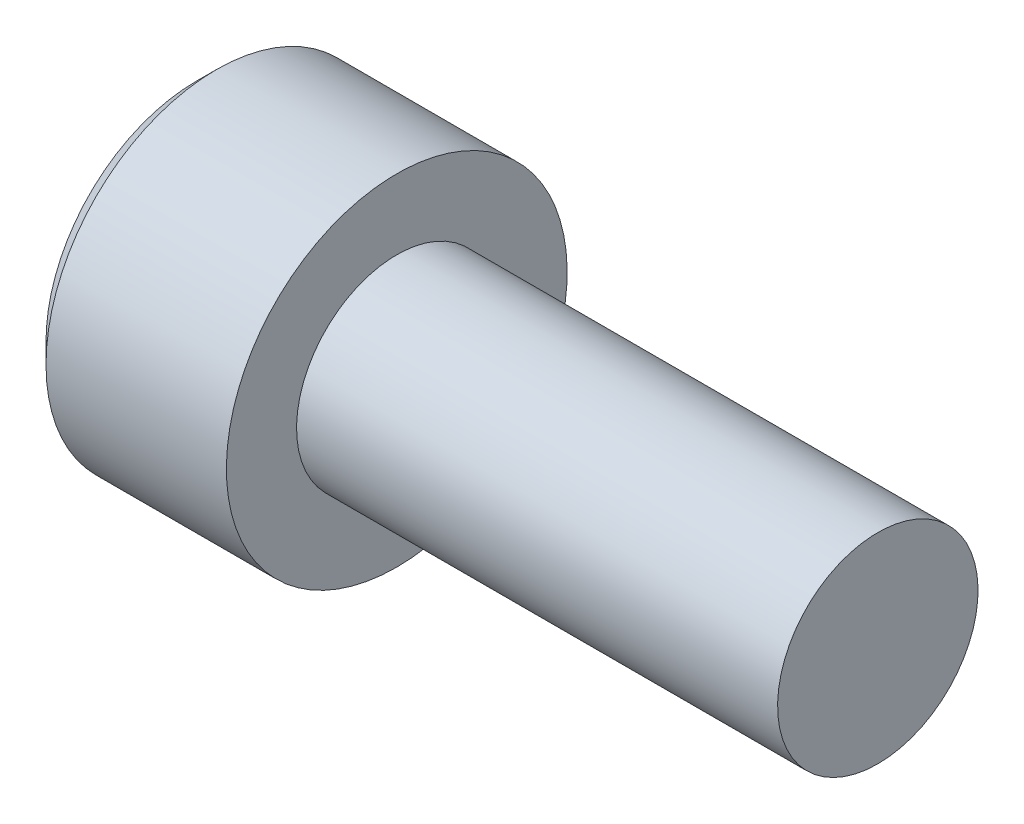
ISO-10303-21;
HEADER;
FILE_DESCRIPTION(('STEP AP214'),'2;1');
FILE_NAME('part.step','',(''),(''),'','','');
FILE_SCHEMA(('AUTOMOTIVE_DESIGN { 1 0 10303 214 1 1 1 1 }'));
ENDSEC;
DATA;
#1=APPLICATION_CONTEXT('core data for automotive mechanical design processes');
#2=APPLICATION_PROTOCOL_DEFINITION('international standard','automotive_design',2000,#1);
#3=PRODUCT_CONTEXT('',#1,'mechanical');
#4=PRODUCT('Part','Part','',(#3));
#5=PRODUCT_RELATED_PRODUCT_CATEGORY('part','',(#4));
#6=PRODUCT_DEFINITION_FORMATION('','',#4);
#7=PRODUCT_DEFINITION_CONTEXT('part definition',#1,'design');
#8=PRODUCT_DEFINITION('design','',#6,#7);
#9=PRODUCT_DEFINITION_SHAPE('','',#8);
#10=(LENGTH_UNIT() NAMED_UNIT(*) SI_UNIT(.MILLI.,.METRE.));
#11=(NAMED_UNIT(*) PLANE_ANGLE_UNIT() SI_UNIT($,.RADIAN.));
#12=(NAMED_UNIT(*) SI_UNIT($,.STERADIAN.) SOLID_ANGLE_UNIT());
#13=UNCERTAINTY_MEASURE_WITH_UNIT(LENGTH_MEASURE(1.E-05),#10,'distance_accuracy_value','');
#14=(GEOMETRIC_REPRESENTATION_CONTEXT(3) GLOBAL_UNCERTAINTY_ASSIGNED_CONTEXT((#13)) GLOBAL_UNIT_ASSIGNED_CONTEXT((#10,
#11,#12)) REPRESENTATION_CONTEXT('',''));
#15=CARTESIAN_POINT('',(0.,0.,0.));
#16=DIRECTION('',(0.,0.,1.));
#17=DIRECTION('',(1.,0.,0.));
#18=AXIS2_PLACEMENT_3D('',#15,#16,#17);
#19=CARTESIAN_POINT('',(-5.,0.,0.));
#20=DIRECTION('',(1.,0.,0.));
#21=DIRECTION('',(0.,1.,0.));
#22=AXIS2_PLACEMENT_3D('',#19,#20,#21);
#23=PLANE('',#22);
#24=CARTESIAN_POINT('',(-5.,0.,0.));
#25=DIRECTION('',(1.,0.,0.));
#26=DIRECTION('',(0.,1.,0.));
#27=AXIS2_PLACEMENT_3D('',#24,#25,#26);
#28=CIRCLE('',#27,3.75);
#29=CARTESIAN_POINT('',(-5.,3.75,0.));
#30=VERTEX_POINT('',#29);
#31=EDGE_CURVE('E44',#30,#30,#28,.F.);
#32=ORIENTED_EDGE('',*,*,#31,.T.);
#33=EDGE_LOOP('',(#32));
#34=FACE_BOUND('',#33,.T.);
#35=DIRECTION('',(0.,-0.5,-0.866025403784439));
#36=VECTOR('',#35,1.);
#37=CARTESIAN_POINT('',(-5.,2.3094010767585,0.));
#38=LINE('',#37,#36);
#39=CARTESIAN_POINT('',(-5.,2.3094010767585,0.));
#40=VERTEX_POINT('',#39);
#41=CARTESIAN_POINT('',(-5.,1.15470053837925,-2.));
#42=VERTEX_POINT('',#41);
#43=EDGE_CURVE('E150',#40,#42,#38,.T.);
#44=ORIENTED_EDGE('',*,*,#43,.F.);
#45=DIRECTION('',(0.,0.5,-0.866025403784439));
#46=VECTOR('',#45,1.);
#47=CARTESIAN_POINT('',(-5.,1.15470053837925,2.));
#48=LINE('',#47,#46);
#49=CARTESIAN_POINT('',(-5.,1.15470053837925,2.));
#50=VERTEX_POINT('',#49);
#51=EDGE_CURVE('E51',#50,#40,#48,.T.);
#52=ORIENTED_EDGE('',*,*,#51,.F.);
#53=DIRECTION('',(0.,1.,0.));
#54=VECTOR('',#53,1.);
#55=CARTESIAN_POINT('',(-5.,-1.15470053837925,2.));
#56=LINE('',#55,#54);
#57=CARTESIAN_POINT('',(-5.,-1.15470053837925,2.));
#58=VERTEX_POINT('',#57);
#59=EDGE_CURVE('E121',#58,#50,#56,.T.);
#60=ORIENTED_EDGE('',*,*,#59,.F.);
#61=DIRECTION('',(0.,0.5,0.866025403784439));
#62=VECTOR('',#61,1.);
#63=CARTESIAN_POINT('',(-5.,-2.3094010767585,0.));
#64=LINE('',#63,#62);
#65=CARTESIAN_POINT('',(-5.,-2.3094010767585,0.));
#66=VERTEX_POINT('',#65);
#67=EDGE_CURVE('E156',#66,#58,#64,.T.);
#68=ORIENTED_EDGE('',*,*,#67,.F.);
#69=DIRECTION('',(0.,-0.5,0.866025403784439));
#70=VECTOR('',#69,1.);
#71=CARTESIAN_POINT('',(-5.,-1.15470053837925,-2.));
#72=LINE('',#71,#70);
#73=CARTESIAN_POINT('',(-5.,-1.15470053837925,-2.));
#74=VERTEX_POINT('',#73);
#75=EDGE_CURVE('E154',#74,#66,#72,.T.);
#76=ORIENTED_EDGE('',*,*,#75,.F.);
#77=DIRECTION('',(0.,-1.,0.));
#78=VECTOR('',#77,1.);
#79=CARTESIAN_POINT('',(-5.,1.15470053837925,-2.));
#80=LINE('',#79,#78);
#81=EDGE_CURVE('E152',#42,#74,#80,.T.);
#82=ORIENTED_EDGE('',*,*,#81,.F.);
#83=EDGE_LOOP('',(#44,#52,#60,#68,#76,#82));
#84=FACE_BOUND('',#83,.T.);
#85=ADVANCED_FACE('F36',(#34,#84),#23,.F.);
#86=CARTESIAN_POINT('',(-5.,0.,0.));
#87=DIRECTION('',(-1.,0.,0.));
#88=DIRECTION('',(0.,-1.,0.));
#89=AXIS2_PLACEMENT_3D('',#86,#87,#88);
#90=CYLINDRICAL_SURFACE('',#89,4.25);
#91=CARTESIAN_POINT('',(-4.5,0.,0.));
#92=DIRECTION('',(1.,0.,0.));
#93=DIRECTION('',(0.,1.,0.));
#94=AXIS2_PLACEMENT_3D('',#91,#92,#93);
#95=CIRCLE('',#94,4.25);
#96=CARTESIAN_POINT('',(-4.5,4.25,0.));
#97=VERTEX_POINT('',#96);
#98=EDGE_CURVE('E11',#97,#97,#95,.T.);
#99=ORIENTED_EDGE('',*,*,#98,.T.);
#100=EDGE_LOOP('',(#99));
#101=FACE_BOUND('',#100,.T.);
#102=CARTESIAN_POINT('',(0.,0.,0.));
#103=DIRECTION('',(-1.,0.,0.));
#104=DIRECTION('',(0.,-1.,0.));
#105=AXIS2_PLACEMENT_3D('',#102,#103,#104);
#106=CIRCLE('',#105,4.25);
#107=CARTESIAN_POINT('',(0.,-4.25,0.));
#108=VERTEX_POINT('',#107);
#109=EDGE_CURVE('E184',#108,#108,#106,.T.);
#110=ORIENTED_EDGE('',*,*,#109,.T.);
#111=EDGE_LOOP('',(#110));
#112=FACE_BOUND('',#111,.T.);
#113=ADVANCED_FACE('F202',(#101,#112),#90,.T.);
#114=CARTESIAN_POINT('',(0.,4.25,0.));
#115=DIRECTION('',(-1.,0.,0.));
#116=DIRECTION('',(0.,-1.,0.));
#117=AXIS2_PLACEMENT_3D('',#114,#115,#116);
#118=PLANE('',#117);
#119=ORIENTED_EDGE('',*,*,#109,.F.);
#120=EDGE_LOOP('',(#119));
#121=FACE_BOUND('',#120,.T.);
#122=CARTESIAN_POINT('',(0.,0.,0.));
#123=DIRECTION('',(-1.,0.,0.));
#124=DIRECTION('',(0.,-1.,0.));
#125=AXIS2_PLACEMENT_3D('',#122,#123,#124);
#126=CIRCLE('',#125,2.5);
#127=CARTESIAN_POINT('',(0.,-2.5,0.));
#128=VERTEX_POINT('',#127);
#129=EDGE_CURVE('E181',#128,#128,#126,.T.);
#130=ORIENTED_EDGE('',*,*,#129,.T.);
#131=EDGE_LOOP('',(#130));
#132=FACE_BOUND('',#131,.T.);
#133=ADVANCED_FACE('F206',(#121,#132),#118,.F.);
#134=CARTESIAN_POINT('',(-5.,0.,0.));
#135=DIRECTION('',(-1.,0.,0.));
#136=DIRECTION('',(0.,-1.,0.));
#137=AXIS2_PLACEMENT_3D('',#134,#135,#136);
#138=CYLINDRICAL_SURFACE('',#137,2.5);
#139=ORIENTED_EDGE('',*,*,#129,.F.);
#140=EDGE_LOOP('',(#139));
#141=FACE_BOUND('',#140,.T.);
#142=CARTESIAN_POINT('',(12.,0.,0.));
#143=DIRECTION('',(-1.,0.,0.));
#144=DIRECTION('',(0.,-1.,0.));
#145=AXIS2_PLACEMENT_3D('',#142,#143,#144);
#146=CIRCLE('',#145,2.5);
#147=CARTESIAN_POINT('',(12.,-2.5,0.));
#148=VERTEX_POINT('',#147);
#149=EDGE_CURVE('E177',#148,#148,#146,.T.);
#150=ORIENTED_EDGE('',*,*,#149,.T.);
#151=EDGE_LOOP('',(#150));
#152=FACE_BOUND('',#151,.T.);
#153=ADVANCED_FACE('F212',(#141,#152),#138,.T.);
#154=CARTESIAN_POINT('',(12.,2.5,0.));
#155=DIRECTION('',(-1.,0.,0.));
#156=DIRECTION('',(0.,-1.,0.));
#157=AXIS2_PLACEMENT_3D('',#154,#155,#156);
#158=PLANE('',#157);
#159=ORIENTED_EDGE('',*,*,#149,.F.);
#160=EDGE_LOOP('',(#159));
#161=FACE_BOUND('',#160,.T.);
#162=ADVANCED_FACE('F216',(#161),#158,.F.);
#163=CARTESIAN_POINT('',(-2.5,1.15470053837925,2.));
#164=DIRECTION('',(0.,0.866025403784439,0.5));
#165=DIRECTION('',(0.,-0.5,0.866025403784439));
#166=AXIS2_PLACEMENT_3D('',#163,#164,#165);
#167=PLANE('',#166);
#168=DIRECTION('',(0.,0.5,-0.866025403784439));
#169=VECTOR('',#168,1.);
#170=CARTESIAN_POINT('',(-2.5,1.15470053837925,2.));
#171=LINE('',#170,#169);
#172=CARTESIAN_POINT('',(-2.5,1.15470053837925,2.));
#173=VERTEX_POINT('',#172);
#174=CARTESIAN_POINT('',(-2.5,1.73205080756888,1.));
#175=VERTEX_POINT('',#174);
#176=EDGE_CURVE('E120',#173,#175,#171,.T.);
#177=ORIENTED_EDGE('',*,*,#176,.F.);
#178=DIRECTION('',(-1.,0.,0.));
#179=VECTOR('',#178,1.);
#180=CARTESIAN_POINT('',(-2.5,1.15470053837925,2.));
#181=LINE('',#180,#179);
#182=EDGE_CURVE('E160',#173,#50,#181,.T.);
#183=ORIENTED_EDGE('',*,*,#182,.T.);
#184=ORIENTED_EDGE('',*,*,#51,.T.);
#185=DIRECTION('',(-1.,0.,0.));
#186=VECTOR('',#185,1.);
#187=CARTESIAN_POINT('',(-2.5,2.3094010767585,0.));
#188=LINE('',#187,#186);
#189=CARTESIAN_POINT('',(-2.5,2.3094010767585,0.));
#190=VERTEX_POINT('',#189);
#191=EDGE_CURVE('E123',#190,#40,#188,.T.);
#192=ORIENTED_EDGE('',*,*,#191,.F.);
#193=EDGE_CURVE('E112',#175,#190,#171,.T.);
#194=ORIENTED_EDGE('',*,*,#193,.F.);
#195=EDGE_LOOP('',(#177,#183,#184,#192,#194));
#196=FACE_BOUND('',#195,.T.);
#197=ADVANCED_FACE('F124',(#196),#167,.F.);
#198=CARTESIAN_POINT('',(-2.5,-1.15470053837925,2.));
#199=DIRECTION('',(0.,0.,1.));
#200=DIRECTION('',(0.,-1.,0.));
#201=AXIS2_PLACEMENT_3D('',#198,#199,#200);
#202=PLANE('',#201);
#203=DIRECTION('',(0.,1.,0.));
#204=VECTOR('',#203,1.);
#205=CARTESIAN_POINT('',(-2.5,-1.15470053837925,2.));
#206=LINE('',#205,#204);
#207=CARTESIAN_POINT('',(-2.5,-1.15470053837925,2.));
#208=VERTEX_POINT('',#207);
#209=CARTESIAN_POINT('',(-2.5,0.,2.));
#210=VERTEX_POINT('',#209);
#211=EDGE_CURVE('E59',#208,#210,#206,.T.);
#212=ORIENTED_EDGE('',*,*,#211,.F.);
#213=DIRECTION('',(-1.,0.,0.));
#214=VECTOR('',#213,1.);
#215=CARTESIAN_POINT('',(-2.5,-1.15470053837925,2.));
#216=LINE('',#215,#214);
#217=EDGE_CURVE('E163',#208,#58,#216,.T.);
#218=ORIENTED_EDGE('',*,*,#217,.T.);
#219=ORIENTED_EDGE('',*,*,#59,.T.);
#220=ORIENTED_EDGE('',*,*,#182,.F.);
#221=EDGE_CURVE('E147',#210,#173,#206,.T.);
#222=ORIENTED_EDGE('',*,*,#221,.F.);
#223=EDGE_LOOP('',(#212,#218,#219,#220,#222));
#224=FACE_BOUND('',#223,.T.);
#225=ADVANCED_FACE('F223',(#224),#202,.F.);
#226=CARTESIAN_POINT('',(-2.5,-2.3094010767585,0.));
#227=DIRECTION('',(0.,-0.866025403784439,0.5));
#228=DIRECTION('',(0.,-0.5,-0.866025403784439));
#229=AXIS2_PLACEMENT_3D('',#226,#227,#228);
#230=PLANE('',#229);
#231=DIRECTION('',(0.,0.5,0.866025403784439));
#232=VECTOR('',#231,1.);
#233=CARTESIAN_POINT('',(-2.5,-2.3094010767585,0.));
#234=LINE('',#233,#232);
#235=CARTESIAN_POINT('',(-2.5,-2.3094010767585,0.));
#236=VERTEX_POINT('',#235);
#237=CARTESIAN_POINT('',(-2.5,-1.73205080756888,1.));
#238=VERTEX_POINT('',#237);
#239=EDGE_CURVE('E144',#236,#238,#234,.T.);
#240=ORIENTED_EDGE('',*,*,#239,.F.);
#241=DIRECTION('',(-1.,0.,0.));
#242=VECTOR('',#241,1.);
#243=CARTESIAN_POINT('',(-2.5,-2.3094010767585,0.));
#244=LINE('',#243,#242);
#245=EDGE_CURVE('E166',#236,#66,#244,.T.);
#246=ORIENTED_EDGE('',*,*,#245,.T.);
#247=ORIENTED_EDGE('',*,*,#67,.T.);
#248=ORIENTED_EDGE('',*,*,#217,.F.);
#249=EDGE_CURVE('E143',#238,#208,#234,.T.);
#250=ORIENTED_EDGE('',*,*,#249,.F.);
#251=EDGE_LOOP('',(#240,#246,#247,#248,#250));
#252=FACE_BOUND('',#251,.T.);
#253=ADVANCED_FACE('F234',(#252),#230,.F.);
#254=CARTESIAN_POINT('',(-2.5,-1.15470053837925,-2.));
#255=DIRECTION('',(0.,-0.866025403784439,-0.5));
#256=DIRECTION('',(0.,0.5,-0.866025403784439));
#257=AXIS2_PLACEMENT_3D('',#254,#255,#256);
#258=PLANE('',#257);
#259=DIRECTION('',(0.,-0.5,0.866025403784439));
#260=VECTOR('',#259,1.);
#261=CARTESIAN_POINT('',(-2.5,-1.15470053837925,-2.));
#262=LINE('',#261,#260);
#263=CARTESIAN_POINT('',(-2.5,-1.15470053837925,-2.));
#264=VERTEX_POINT('',#263);
#265=CARTESIAN_POINT('',(-2.5,-1.73205080756888,-1.));
#266=VERTEX_POINT('',#265);
#267=EDGE_CURVE('E140',#264,#266,#262,.T.);
#268=ORIENTED_EDGE('',*,*,#267,.F.);
#269=DIRECTION('',(-1.,0.,0.));
#270=VECTOR('',#269,1.);
#271=CARTESIAN_POINT('',(-2.5,-1.15470053837925,-2.));
#272=LINE('',#271,#270);
#273=EDGE_CURVE('E169',#264,#74,#272,.T.);
#274=ORIENTED_EDGE('',*,*,#273,.T.);
#275=ORIENTED_EDGE('',*,*,#75,.T.);
#276=ORIENTED_EDGE('',*,*,#245,.F.);
#277=EDGE_CURVE('E139',#266,#236,#262,.T.);
#278=ORIENTED_EDGE('',*,*,#277,.F.);
#279=EDGE_LOOP('',(#268,#274,#275,#276,#278));
#280=FACE_BOUND('',#279,.T.);
#281=ADVANCED_FACE('F230',(#280),#258,.F.);
#282=CARTESIAN_POINT('',(-2.5,1.15470053837925,-2.));
#283=DIRECTION('',(0.,0.,-1.));
#284=DIRECTION('',(0.,1.,0.));
#285=AXIS2_PLACEMENT_3D('',#282,#283,#284);
#286=PLANE('',#285);
#287=DIRECTION('',(0.,-1.,0.));
#288=VECTOR('',#287,1.);
#289=CARTESIAN_POINT('',(-2.5,1.15470053837925,-2.));
#290=LINE('',#289,#288);
#291=CARTESIAN_POINT('',(-2.5,1.15470053837925,-2.));
#292=VERTEX_POINT('',#291);
#293=CARTESIAN_POINT('',(-2.5,0.,-2.));
#294=VERTEX_POINT('',#293);
#295=EDGE_CURVE('E135',#292,#294,#290,.T.);
#296=ORIENTED_EDGE('',*,*,#295,.F.);
#297=DIRECTION('',(-1.,0.,0.));
#298=VECTOR('',#297,1.);
#299=CARTESIAN_POINT('',(-2.5,1.15470053837925,-2.));
#300=LINE('',#299,#298);
#301=EDGE_CURVE('E127',#292,#42,#300,.T.);
#302=ORIENTED_EDGE('',*,*,#301,.T.);
#303=ORIENTED_EDGE('',*,*,#81,.T.);
#304=ORIENTED_EDGE('',*,*,#273,.F.);
#305=EDGE_CURVE('E133',#294,#264,#290,.T.);
#306=ORIENTED_EDGE('',*,*,#305,.F.);
#307=EDGE_LOOP('',(#296,#302,#303,#304,#306));
#308=FACE_BOUND('',#307,.T.);
#309=ADVANCED_FACE('F227',(#308),#286,.F.);
#310=CARTESIAN_POINT('',(-2.5,2.3094010767585,0.));
#311=DIRECTION('',(0.,0.866025403784439,-0.5));
#312=DIRECTION('',(0.,0.5,0.866025403784439));
#313=AXIS2_PLACEMENT_3D('',#310,#311,#312);
#314=PLANE('',#313);
#315=DIRECTION('',(0.,-0.5,-0.866025403784439));
#316=VECTOR('',#315,1.);
#317=CARTESIAN_POINT('',(-2.5,2.3094010767585,0.));
#318=LINE('',#317,#316);
#319=CARTESIAN_POINT('',(-2.5,1.73205080756888,-1.));
#320=VERTEX_POINT('',#319);
#321=EDGE_CURVE('E115',#190,#320,#318,.T.);
#322=ORIENTED_EDGE('',*,*,#321,.F.);
#323=ORIENTED_EDGE('',*,*,#191,.T.);
#324=ORIENTED_EDGE('',*,*,#43,.T.);
#325=ORIENTED_EDGE('',*,*,#301,.F.);
#326=EDGE_CURVE('E132',#320,#292,#318,.T.);
#327=ORIENTED_EDGE('',*,*,#326,.F.);
#328=EDGE_LOOP('',(#322,#323,#324,#325,#327));
#329=FACE_BOUND('',#328,.T.);
#330=ADVANCED_FACE('F130',(#329),#314,.F.);
#331=CARTESIAN_POINT('',(-2.5,0.,0.));
#332=DIRECTION('',(-1.,0.,0.));
#333=DIRECTION('',(0.,0.,1.));
#334=AXIS2_PLACEMENT_3D('',#331,#332,#333);
#335=PLANE('',#334);
#336=ORIENTED_EDGE('',*,*,#221,.T.);
#337=ORIENTED_EDGE('',*,*,#176,.T.);
#338=CARTESIAN_POINT('',(-2.5,0.,0.));
#339=DIRECTION('',(-1.,0.,0.));
#340=DIRECTION('',(0.,-1.,0.));
#341=AXIS2_PLACEMENT_3D('',#338,#339,#340);
#342=CIRCLE('',#341,2.);
#343=EDGE_CURVE('E178',#210,#175,#342,.T.);
#344=ORIENTED_EDGE('',*,*,#343,.F.);
#345=EDGE_LOOP('',(#336,#337,#344));
#346=FACE_BOUND('',#345,.T.);
#347=ADVANCED_FACE('F226',(#346),#335,.T.);
#348=ORIENTED_EDGE('',*,*,#193,.T.);
#349=ORIENTED_EDGE('',*,*,#321,.T.);
#350=EDGE_CURVE('E117',#175,#320,#342,.T.);
#351=ORIENTED_EDGE('',*,*,#350,.F.);
#352=EDGE_LOOP('',(#348,#349,#351));
#353=FACE_BOUND('',#352,.T.);
#354=ADVANCED_FACE('F113',(#353),#335,.T.);
#355=ORIENTED_EDGE('',*,*,#326,.T.);
#356=ORIENTED_EDGE('',*,*,#295,.T.);
#357=EDGE_CURVE('E266',#320,#294,#342,.T.);
#358=ORIENTED_EDGE('',*,*,#357,.F.);
#359=EDGE_LOOP('',(#355,#356,#358));
#360=FACE_BOUND('',#359,.T.);
#361=ADVANCED_FACE('F254',(#360),#335,.T.);
#362=ORIENTED_EDGE('',*,*,#305,.T.);
#363=ORIENTED_EDGE('',*,*,#267,.T.);
#364=EDGE_CURVE('E270',#294,#266,#342,.T.);
#365=ORIENTED_EDGE('',*,*,#364,.F.);
#366=EDGE_LOOP('',(#362,#363,#365));
#367=FACE_BOUND('',#366,.T.);
#368=ADVANCED_FACE('F247',(#367),#335,.T.);
#369=ORIENTED_EDGE('',*,*,#277,.T.);
#370=ORIENTED_EDGE('',*,*,#239,.T.);
#371=EDGE_CURVE('E162',#266,#238,#342,.T.);
#372=ORIENTED_EDGE('',*,*,#371,.F.);
#373=EDGE_LOOP('',(#369,#370,#372));
#374=FACE_BOUND('',#373,.T.);
#375=ADVANCED_FACE('F243',(#374),#335,.T.);
#376=ORIENTED_EDGE('',*,*,#249,.T.);
#377=ORIENTED_EDGE('',*,*,#211,.T.);
#378=EDGE_CURVE('E174',#238,#210,#342,.T.);
#379=ORIENTED_EDGE('',*,*,#378,.F.);
#380=EDGE_LOOP('',(#376,#377,#379));
#381=FACE_BOUND('',#380,.T.);
#382=ADVANCED_FACE('F197',(#381),#335,.T.);
#383=CARTESIAN_POINT('',(-1.34529946162075,0.,0.));
#384=DIRECTION('',(-1.,0.,0.));
#385=DIRECTION('',(0.,-1.,0.));
#386=AXIS2_PLACEMENT_3D('',#383,#384,#385);
#387=CONICAL_SURFACE('',#386,0.,1.0471975511966);
#388=ORIENTED_EDGE('',*,*,#378,.T.);
#389=ORIENTED_EDGE('',*,*,#343,.T.);
#390=ORIENTED_EDGE('',*,*,#350,.T.);
#391=ORIENTED_EDGE('',*,*,#357,.T.);
#392=ORIENTED_EDGE('',*,*,#364,.T.);
#393=ORIENTED_EDGE('',*,*,#371,.T.);
#394=EDGE_LOOP('',(#388,#389,#390,#391,#392,#393));
#395=FACE_BOUND('',#394,.T.);
#396=CARTESIAN_POINT('',(-1.34529946162075,0.,0.));
#397=VERTEX_POINT('',#396);
#398=VERTEX_LOOP('',#397);
#399=FACE_BOUND('',#398,.T.);
#400=ADVANCED_FACE('F192',(#395,#399),#387,.F.);
#401=CARTESIAN_POINT('',(-5.,0.,0.));
#402=DIRECTION('',(1.,0.,0.));
#403=DIRECTION('',(0.,1.,0.));
#404=AXIS2_PLACEMENT_3D('',#401,#402,#403);
#405=CONICAL_SURFACE('',#404,3.75,0.785398163397447);
#406=ORIENTED_EDGE('',*,*,#98,.F.);
#407=EDGE_LOOP('',(#406));
#408=FACE_BOUND('',#407,.T.);
#409=ORIENTED_EDGE('',*,*,#31,.F.);
#410=EDGE_LOOP('',(#409));
#411=FACE_BOUND('',#410,.T.);
#412=ADVANCED_FACE('F38',(#408,#411),#405,.T.);
#413=CLOSED_SHELL('',(#85,#113,#133,#153,#162,#197,#225,#253,#281,#309,#330,#347,#354,#361,#368,
#375,#382,#400,#412));
#414=MANIFOLD_SOLID_BREP('B2',#413);
#415=ADVANCED_BREP_SHAPE_REPRESENTATION('',(#18,#414),#14);
#416=SHAPE_DEFINITION_REPRESENTATION(#9,#415);
ENDSEC;
END-ISO-10303-21;
